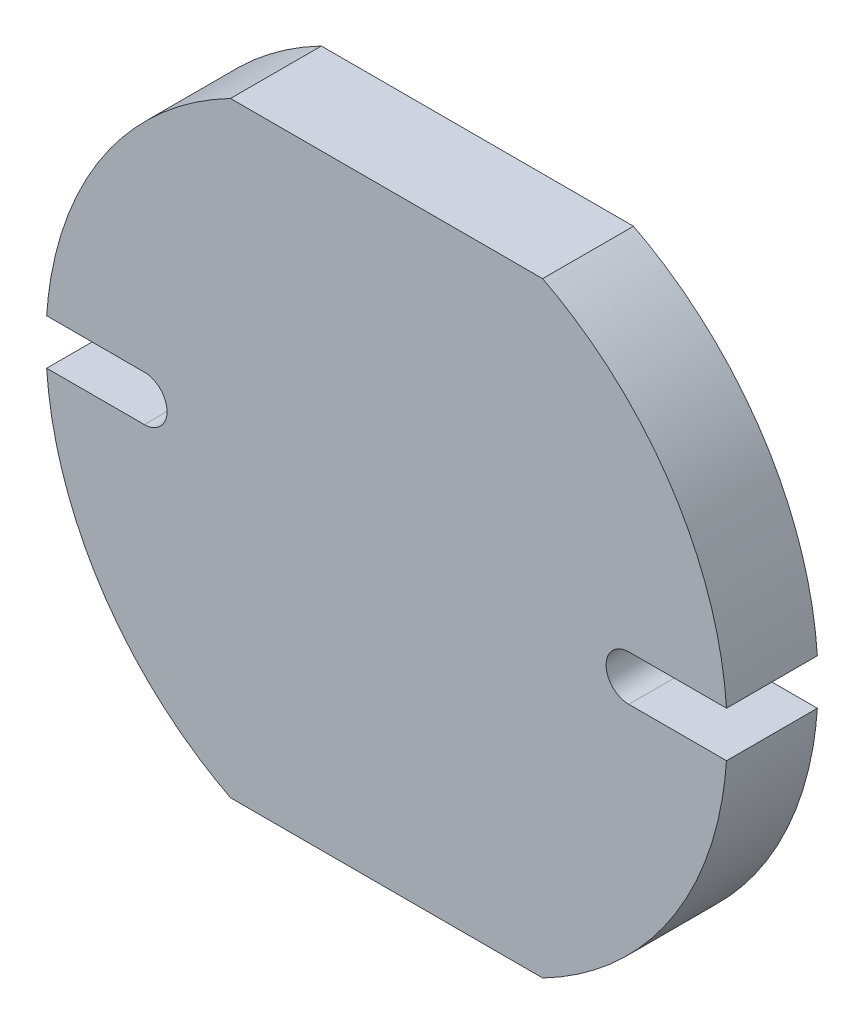
ISO-10303-21;
HEADER;
FILE_DESCRIPTION(('STEP AP214'),'2;1');
FILE_NAME('part.step','',(''),(''),'','','');
FILE_SCHEMA(('AUTOMOTIVE_DESIGN { 1 0 10303 214 1 1 1 1 }'));
ENDSEC;
DATA;
#1=APPLICATION_CONTEXT('core data for automotive mechanical design processes');
#2=APPLICATION_PROTOCOL_DEFINITION('international standard','automotive_design',2000,#1);
#3=PRODUCT_CONTEXT('',#1,'mechanical');
#4=PRODUCT('Part','Part','',(#3));
#5=PRODUCT_RELATED_PRODUCT_CATEGORY('part','',(#4));
#6=PRODUCT_DEFINITION_FORMATION('','',#4);
#7=PRODUCT_DEFINITION_CONTEXT('part definition',#1,'design');
#8=PRODUCT_DEFINITION('design','',#6,#7);
#9=PRODUCT_DEFINITION_SHAPE('','',#8);
#10=(LENGTH_UNIT() NAMED_UNIT(*) SI_UNIT(.MILLI.,.METRE.));
#11=(NAMED_UNIT(*) PLANE_ANGLE_UNIT() SI_UNIT($,.RADIAN.));
#12=(NAMED_UNIT(*) SI_UNIT($,.STERADIAN.) SOLID_ANGLE_UNIT());
#13=UNCERTAINTY_MEASURE_WITH_UNIT(LENGTH_MEASURE(1.E-05),#10,'distance_accuracy_value','');
#14=(GEOMETRIC_REPRESENTATION_CONTEXT(3) GLOBAL_UNCERTAINTY_ASSIGNED_CONTEXT((#13)) GLOBAL_UNIT_ASSIGNED_CONTEXT((#10,
#11,#12)) REPRESENTATION_CONTEXT('',''));
#15=CARTESIAN_POINT('',(0.,0.,0.));
#16=DIRECTION('',(0.,0.,1.));
#17=DIRECTION('',(1.,0.,0.));
#18=AXIS2_PLACEMENT_3D('',#15,#16,#17);
#19=CARTESIAN_POINT('',(-2.244994432064,-2.,0.6));
#20=CARTESIAN_POINT('',(-2.244994432064,2.,0.6));
#21=CARTESIAN_POINT('',(2.244994432064,-2.,0.6));
#22=CARTESIAN_POINT('',(2.244994432064,2.,0.6));
#23=(BOUNDED_SURFACE() B_SPLINE_SURFACE(1,1,((#19,#20),(#21,#22)),.UNSPECIFIED.,.F.,.F.,
.F.) B_SPLINE_SURFACE_WITH_KNOTS((2,2),(2,2),(-2.244994432064,2.244994432064),(-2.,2.),
.UNSPECIFIED.) GEOMETRIC_REPRESENTATION_ITEM() RATIONAL_B_SPLINE_SURFACE(((1.,1.),(1.,1.))) REPRESENTATION_ITEM('') SURFACE());
#24=CARTESIAN_POINT('',(-2.244994432064,-0.149999999998,0.6));
#25=CARTESIAN_POINT('',(-2.160281546554,-1.417866375311,0.6));
#26=CARTESIAN_POINT('',(-1.030776406404,-2.,0.6));
#27=(BOUNDED_CURVE() B_SPLINE_CURVE(2,(#24,#25,#26),.UNSPECIFIED.,.F.,
.F.) B_SPLINE_CURVE_WITH_KNOTS((3,3),(1.637512475204,2.66571040393),
.UNSPECIFIED.) CURVE() GEOMETRIC_REPRESENTATION_ITEM() RATIONAL_B_SPLINE_CURVE((1.,
0.870736160409,1.)) REPRESENTATION_ITEM(''));
#28=CARTESIAN_POINT('',(-2.244994432064,-0.149999999998,0.6));
#29=VERTEX_POINT('',#28);
#30=CARTESIAN_POINT('',(-1.030776406404,-2.,0.6));
#31=VERTEX_POINT('',#30);
#32=EDGE_CURVE('E145',#29,#31,#27,.T.);
#33=CARTESIAN_POINT('',(-1.030776406404,-2.,0.6));
#34=CARTESIAN_POINT('',(1.030776406404,-2.,0.6));
#35=(BOUNDED_CURVE() B_SPLINE_CURVE(1,(#33,#34),.UNSPECIFIED.,.F.,
.F.) B_SPLINE_CURVE_WITH_KNOTS((2,2),(0.,2.061552812808),
.UNSPECIFIED.) CURVE() GEOMETRIC_REPRESENTATION_ITEM() RATIONAL_B_SPLINE_CURVE((1.,1.)) REPRESENTATION_ITEM(''));
#36=CARTESIAN_POINT('',(1.030776406404,-2.,0.6));
#37=VERTEX_POINT('',#36);
#38=EDGE_CURVE('E372',#31,#37,#35,.T.);
#39=CARTESIAN_POINT('',(1.030776406404,-2.,0.6));
#40=CARTESIAN_POINT('',(2.160281546554,-1.417866375311,0.6));
#41=CARTESIAN_POINT('',(2.244994432064,-0.149999999998,0.6));
#42=(BOUNDED_CURVE() B_SPLINE_CURVE(2,(#39,#40,#41),.UNSPECIFIED.,.F.,
.F.) B_SPLINE_CURVE_WITH_KNOTS((3,3),(3.61747490325,4.645672831975),
.UNSPECIFIED.) CURVE() GEOMETRIC_REPRESENTATION_ITEM() RATIONAL_B_SPLINE_CURVE((1.,
0.870736160409,1.)) REPRESENTATION_ITEM(''));
#43=CARTESIAN_POINT('',(2.244994432064,-0.149999999998,0.6));
#44=VERTEX_POINT('',#43);
#45=EDGE_CURVE('E189',#37,#44,#42,.T.);
#46=CARTESIAN_POINT('',(2.244994432064,-0.149999999998,0.6));
#47=CARTESIAN_POINT('',(1.6,-0.149999999998,0.6));
#48=(BOUNDED_CURVE() B_SPLINE_CURVE(1,(#46,#47),.UNSPECIFIED.,.F.,
.F.) B_SPLINE_CURVE_WITH_KNOTS((2,2),(0.,0.644994432064),
.UNSPECIFIED.) CURVE() GEOMETRIC_REPRESENTATION_ITEM() RATIONAL_B_SPLINE_CURVE((1.,1.)) REPRESENTATION_ITEM(''));
#49=CARTESIAN_POINT('',(1.6,-0.149999999999,0.6));
#50=VERTEX_POINT('',#49);
#51=EDGE_CURVE('E317',#44,#50,#48,.T.);
#52=CARTESIAN_POINT('',(1.6,0.15,0.6));
#53=CARTESIAN_POINT('',(1.45,0.15,0.6));
#54=CARTESIAN_POINT('',(1.45,0.,0.6));
#55=CARTESIAN_POINT('',(1.45,-0.15,0.6));
#56=CARTESIAN_POINT('',(1.6,-0.15,0.6));
#57=(BOUNDED_CURVE() B_SPLINE_CURVE(2,(#52,#53,#54,#55,#56),.UNSPECIFIED.,.F.,
.F.) B_SPLINE_CURVE_WITH_KNOTS((3,2,3),(0.,1.570796326795,3.14159265359),
.UNSPECIFIED.) CURVE() GEOMETRIC_REPRESENTATION_ITEM() RATIONAL_B_SPLINE_CURVE((1.,
0.707106781187,1.,0.707106781187,1.)) REPRESENTATION_ITEM(''));
#58=CARTESIAN_POINT('',(1.6,0.149999999999,0.6));
#59=VERTEX_POINT('',#58);
#60=EDGE_CURVE('E23',#59,#50,#57,.T.);
#61=CARTESIAN_POINT('',(2.244994432064,0.149999999998,0.6));
#62=CARTESIAN_POINT('',(1.6,0.149999999998,0.6));
#63=(BOUNDED_CURVE() B_SPLINE_CURVE(1,(#61,#62),.UNSPECIFIED.,.F.,
.F.) B_SPLINE_CURVE_WITH_KNOTS((2,2),(0.,0.644994432064),
.UNSPECIFIED.) CURVE() GEOMETRIC_REPRESENTATION_ITEM() RATIONAL_B_SPLINE_CURVE((1.,1.)) REPRESENTATION_ITEM(''));
#64=CARTESIAN_POINT('',(2.244994432064,0.149999999998,0.6));
#65=VERTEX_POINT('',#64);
#66=EDGE_CURVE('E363',#65,#59,#63,.T.);
#67=CARTESIAN_POINT('',(2.244994432064,0.149999999998,0.6));
#68=CARTESIAN_POINT('',(2.160281546554,1.417866375311,0.6));
#69=CARTESIAN_POINT('',(1.030776406404,2.,0.6));
#70=(BOUNDED_CURVE() B_SPLINE_CURVE(2,(#67,#68,#69),.UNSPECIFIED.,.F.,
.F.) B_SPLINE_CURVE_WITH_KNOTS((3,3),(4.779105128794,5.807303057519),
.UNSPECIFIED.) CURVE() GEOMETRIC_REPRESENTATION_ITEM() RATIONAL_B_SPLINE_CURVE((1.,
0.870736160409,1.)) REPRESENTATION_ITEM(''));
#71=CARTESIAN_POINT('',(1.030776406404,2.,0.6));
#72=VERTEX_POINT('',#71);
#73=EDGE_CURVE('E219',#65,#72,#70,.T.);
#74=CARTESIAN_POINT('',(-1.030776406404,2.,0.6));
#75=CARTESIAN_POINT('',(1.030776406404,2.,0.6));
#76=(BOUNDED_CURVE() B_SPLINE_CURVE(1,(#74,#75),.UNSPECIFIED.,.F.,
.F.) B_SPLINE_CURVE_WITH_KNOTS((2,2),(0.,2.061552812808),
.UNSPECIFIED.) CURVE() GEOMETRIC_REPRESENTATION_ITEM() RATIONAL_B_SPLINE_CURVE((1.,1.)) REPRESENTATION_ITEM(''));
#77=CARTESIAN_POINT('',(-1.030776406404,2.,0.6));
#78=VERTEX_POINT('',#77);
#79=EDGE_CURVE('E257',#78,#72,#76,.T.);
#80=CARTESIAN_POINT('',(-1.030776406404,2.,0.6));
#81=CARTESIAN_POINT('',(-2.160281546554,1.417866375311,0.6));
#82=CARTESIAN_POINT('',(-2.244994432064,0.149999999999,0.6));
#83=(BOUNDED_CURVE() B_SPLINE_CURVE(2,(#80,#81,#82),.UNSPECIFIED.,.F.,
.F.) B_SPLINE_CURVE_WITH_KNOTS((3,3),(0.47588224966,1.504080178385),
.UNSPECIFIED.) CURVE() GEOMETRIC_REPRESENTATION_ITEM() RATIONAL_B_SPLINE_CURVE((1.,
0.87073616041,1.)) REPRESENTATION_ITEM(''));
#84=CARTESIAN_POINT('',(-2.244994432064,0.149999999999,0.6));
#85=VERTEX_POINT('',#84);
#86=EDGE_CURVE('E209',#78,#85,#83,.T.);
#87=CARTESIAN_POINT('',(-2.244994432064,0.15,0.6));
#88=CARTESIAN_POINT('',(-1.6,0.15,0.6));
#89=(BOUNDED_CURVE() B_SPLINE_CURVE(1,(#87,#88),.UNSPECIFIED.,.F.,
.F.) B_SPLINE_CURVE_WITH_KNOTS((2,2),(0.,0.644994432064),
.UNSPECIFIED.) CURVE() GEOMETRIC_REPRESENTATION_ITEM() RATIONAL_B_SPLINE_CURVE((1.,1.)) REPRESENTATION_ITEM(''));
#90=CARTESIAN_POINT('',(-1.6,0.15,0.6));
#91=VERTEX_POINT('',#90);
#92=EDGE_CURVE('E63',#85,#91,#89,.T.);
#93=CARTESIAN_POINT('',(-1.6,-0.15,0.6));
#94=CARTESIAN_POINT('',(-1.45,-0.15,0.6));
#95=CARTESIAN_POINT('',(-1.45,0.,0.6));
#96=CARTESIAN_POINT('',(-1.45,0.15,0.6));
#97=CARTESIAN_POINT('',(-1.6,0.15,0.6));
#98=(BOUNDED_CURVE() B_SPLINE_CURVE(2,(#93,#94,#95,#96,#97),.UNSPECIFIED.,.F.,
.F.) B_SPLINE_CURVE_WITH_KNOTS((3,2,3),(3.14159265359,4.712388980385,6.28318530718),
.UNSPECIFIED.) CURVE() GEOMETRIC_REPRESENTATION_ITEM() RATIONAL_B_SPLINE_CURVE((1.,
0.707106781187,1.,0.707106781187,1.)) REPRESENTATION_ITEM(''));
#99=CARTESIAN_POINT('',(-1.6,-0.149999999999,0.6));
#100=VERTEX_POINT('',#99);
#101=EDGE_CURVE('E147',#100,#91,#98,.T.);
#102=CARTESIAN_POINT('',(-2.244994432064,-0.149999999998,0.6));
#103=CARTESIAN_POINT('',(-1.6,-0.149999999998,0.6));
#104=(BOUNDED_CURVE() B_SPLINE_CURVE(1,(#102,#103),.UNSPECIFIED.,.F.,
.F.) B_SPLINE_CURVE_WITH_KNOTS((2,2),(0.,0.644994432064),
.UNSPECIFIED.) CURVE() GEOMETRIC_REPRESENTATION_ITEM() RATIONAL_B_SPLINE_CURVE((1.,1.)) REPRESENTATION_ITEM(''));
#105=EDGE_CURVE('E32',#29,#100,#104,.T.);
#106=ORIENTED_EDGE('',*,*,#32,.T.);
#107=ORIENTED_EDGE('',*,*,#38,.T.);
#108=ORIENTED_EDGE('',*,*,#45,.T.);
#109=ORIENTED_EDGE('',*,*,#51,.T.);
#110=ORIENTED_EDGE('',*,*,#60,.F.);
#111=ORIENTED_EDGE('',*,*,#66,.F.);
#112=ORIENTED_EDGE('',*,*,#73,.T.);
#113=ORIENTED_EDGE('',*,*,#79,.F.);
#114=ORIENTED_EDGE('',*,*,#86,.T.);
#115=ORIENTED_EDGE('',*,*,#92,.T.);
#116=ORIENTED_EDGE('',*,*,#101,.F.);
#117=ORIENTED_EDGE('',*,*,#105,.F.);
#118=EDGE_LOOP('',(#106,#107,#108,#109,#110,#111,#112,#113,#114,#115,#116,#117));
#119=FACE_BOUND('',#118,.T.);
#120=ADVANCED_FACE('F17',(#119),#23,.T.);
#121=CARTESIAN_POINT('',(-2.244994432064,-2.,0.));
#122=CARTESIAN_POINT('',(-2.244994432064,2.,0.));
#123=CARTESIAN_POINT('',(2.244994432064,-2.,0.));
#124=CARTESIAN_POINT('',(2.244994432064,2.,0.));
#125=(BOUNDED_SURFACE() B_SPLINE_SURFACE(1,1,((#121,#122),(#123,#124)),.UNSPECIFIED.,.F.,.F.,
.F.) B_SPLINE_SURFACE_WITH_KNOTS((2,2),(2,2),(-2.244994432064,2.244994432064),(-2.,2.),
.UNSPECIFIED.) GEOMETRIC_REPRESENTATION_ITEM() RATIONAL_B_SPLINE_SURFACE(((1.,1.),(1.,1.))) REPRESENTATION_ITEM('') SURFACE());
#126=CARTESIAN_POINT('',(-2.244994432064,-0.149999999998,0.));
#127=CARTESIAN_POINT('',(-1.6,-0.149999999998,0.));
#128=(BOUNDED_CURVE() B_SPLINE_CURVE(1,(#126,#127),.UNSPECIFIED.,.F.,
.F.) B_SPLINE_CURVE_WITH_KNOTS((2,2),(0.,0.644994432064),
.UNSPECIFIED.) CURVE() GEOMETRIC_REPRESENTATION_ITEM() RATIONAL_B_SPLINE_CURVE((1.,1.)) REPRESENTATION_ITEM(''));
#129=CARTESIAN_POINT('',(-2.244994432064,-0.149999999998,0.));
#130=VERTEX_POINT('',#129);
#131=CARTESIAN_POINT('',(-1.6,-0.149999999999,0.));
#132=VERTEX_POINT('',#131);
#133=EDGE_CURVE('E11',#130,#132,#128,.T.);
#134=CARTESIAN_POINT('',(-1.6,-0.15,0.));
#135=CARTESIAN_POINT('',(-1.45,-0.15,0.));
#136=CARTESIAN_POINT('',(-1.45,0.,0.));
#137=CARTESIAN_POINT('',(-1.45,0.15,0.));
#138=CARTESIAN_POINT('',(-1.6,0.15,0.));
#139=(BOUNDED_CURVE() B_SPLINE_CURVE(2,(#134,#135,#136,#137,#138),.UNSPECIFIED.,.F.,
.F.) B_SPLINE_CURVE_WITH_KNOTS((3,2,3),(3.14159265359,4.712388980385,6.28318530718),
.UNSPECIFIED.) CURVE() GEOMETRIC_REPRESENTATION_ITEM() RATIONAL_B_SPLINE_CURVE((1.,
0.707106781187,1.,0.707106781187,1.)) REPRESENTATION_ITEM(''));
#140=CARTESIAN_POINT('',(-1.6,0.15,0.));
#141=VERTEX_POINT('',#140);
#142=EDGE_CURVE('E150',#132,#141,#139,.T.);
#143=CARTESIAN_POINT('',(-2.244994432064,0.15,0.));
#144=CARTESIAN_POINT('',(-1.6,0.15,0.));
#145=(BOUNDED_CURVE() B_SPLINE_CURVE(1,(#143,#144),.UNSPECIFIED.,.F.,
.F.) B_SPLINE_CURVE_WITH_KNOTS((2,2),(0.,0.644994432064),
.UNSPECIFIED.) CURVE() GEOMETRIC_REPRESENTATION_ITEM() RATIONAL_B_SPLINE_CURVE((1.,1.)) REPRESENTATION_ITEM(''));
#146=CARTESIAN_POINT('',(-2.244994432064,0.149999999999,0.));
#147=VERTEX_POINT('',#146);
#148=EDGE_CURVE('E78',#147,#141,#145,.T.);
#149=CARTESIAN_POINT('',(-1.030776406404,2.,0.));
#150=CARTESIAN_POINT('',(-2.160281546554,1.417866375311,0.));
#151=CARTESIAN_POINT('',(-2.244994432064,0.149999999999,0.));
#152=(BOUNDED_CURVE() B_SPLINE_CURVE(2,(#149,#150,#151),.UNSPECIFIED.,.F.,
.F.) B_SPLINE_CURVE_WITH_KNOTS((3,3),(0.47588224966,1.504080178385),
.UNSPECIFIED.) CURVE() GEOMETRIC_REPRESENTATION_ITEM() RATIONAL_B_SPLINE_CURVE((1.,
0.87073616041,1.)) REPRESENTATION_ITEM(''));
#153=CARTESIAN_POINT('',(-1.030776406404,2.,0.));
#154=VERTEX_POINT('',#153);
#155=EDGE_CURVE('E210',#154,#147,#152,.T.);
#156=CARTESIAN_POINT('',(-1.030776406404,2.,0.));
#157=CARTESIAN_POINT('',(1.030776406404,2.,0.));
#158=(BOUNDED_CURVE() B_SPLINE_CURVE(1,(#156,#157),.UNSPECIFIED.,.F.,
.F.) B_SPLINE_CURVE_WITH_KNOTS((2,2),(0.,2.061552812808),
.UNSPECIFIED.) CURVE() GEOMETRIC_REPRESENTATION_ITEM() RATIONAL_B_SPLINE_CURVE((1.,1.)) REPRESENTATION_ITEM(''));
#159=CARTESIAN_POINT('',(1.030776406404,2.,0.));
#160=VERTEX_POINT('',#159);
#161=EDGE_CURVE('E265',#154,#160,#158,.T.);
#162=CARTESIAN_POINT('',(2.244994432064,0.149999999998,0.));
#163=CARTESIAN_POINT('',(2.160281546554,1.417866375311,0.));
#164=CARTESIAN_POINT('',(1.030776406404,2.,0.));
#165=(BOUNDED_CURVE() B_SPLINE_CURVE(2,(#162,#163,#164),.UNSPECIFIED.,.F.,
.F.) B_SPLINE_CURVE_WITH_KNOTS((3,3),(4.779105128794,5.807303057519),
.UNSPECIFIED.) CURVE() GEOMETRIC_REPRESENTATION_ITEM() RATIONAL_B_SPLINE_CURVE((1.,
0.870736160409,1.)) REPRESENTATION_ITEM(''));
#166=CARTESIAN_POINT('',(2.244994432064,0.149999999998,0.));
#167=VERTEX_POINT('',#166);
#168=EDGE_CURVE('E331',#167,#160,#165,.T.);
#169=CARTESIAN_POINT('',(2.244994432064,0.149999999998,0.));
#170=CARTESIAN_POINT('',(1.6,0.149999999998,0.));
#171=(BOUNDED_CURVE() B_SPLINE_CURVE(1,(#169,#170),.UNSPECIFIED.,.F.,
.F.) B_SPLINE_CURVE_WITH_KNOTS((2,2),(0.,0.644994432064),
.UNSPECIFIED.) CURVE() GEOMETRIC_REPRESENTATION_ITEM() RATIONAL_B_SPLINE_CURVE((1.,1.)) REPRESENTATION_ITEM(''));
#172=CARTESIAN_POINT('',(1.6,0.149999999999,0.));
#173=VERTEX_POINT('',#172);
#174=EDGE_CURVE('E340',#167,#173,#171,.T.);
#175=CARTESIAN_POINT('',(1.6,0.15,0.));
#176=CARTESIAN_POINT('',(1.45,0.15,0.));
#177=CARTESIAN_POINT('',(1.45,0.,0.));
#178=CARTESIAN_POINT('',(1.45,-0.15,0.));
#179=CARTESIAN_POINT('',(1.6,-0.15,0.));
#180=(BOUNDED_CURVE() B_SPLINE_CURVE(2,(#175,#176,#177,#178,#179),.UNSPECIFIED.,.F.,
.F.) B_SPLINE_CURVE_WITH_KNOTS((3,2,3),(0.,1.570796326795,3.14159265359),
.UNSPECIFIED.) CURVE() GEOMETRIC_REPRESENTATION_ITEM() RATIONAL_B_SPLINE_CURVE((1.,
0.707106781187,1.,0.707106781187,1.)) REPRESENTATION_ITEM(''));
#181=CARTESIAN_POINT('',(1.6,-0.149999999999,0.));
#182=VERTEX_POINT('',#181);
#183=EDGE_CURVE('E112',#173,#182,#180,.T.);
#184=CARTESIAN_POINT('',(2.244994432064,-0.149999999998,0.));
#185=CARTESIAN_POINT('',(1.6,-0.149999999998,0.));
#186=(BOUNDED_CURVE() B_SPLINE_CURVE(1,(#184,#185),.UNSPECIFIED.,.F.,
.F.) B_SPLINE_CURVE_WITH_KNOTS((2,2),(0.,0.644994432064),
.UNSPECIFIED.) CURVE() GEOMETRIC_REPRESENTATION_ITEM() RATIONAL_B_SPLINE_CURVE((1.,1.)) REPRESENTATION_ITEM(''));
#187=CARTESIAN_POINT('',(2.244994432064,-0.149999999998,0.));
#188=VERTEX_POINT('',#187);
#189=EDGE_CURVE('E190',#188,#182,#186,.T.);
#190=CARTESIAN_POINT('',(1.030776406404,-2.,0.));
#191=CARTESIAN_POINT('',(2.160281546554,-1.417866375311,0.));
#192=CARTESIAN_POINT('',(2.244994432064,-0.149999999998,0.));
#193=(BOUNDED_CURVE() B_SPLINE_CURVE(2,(#190,#191,#192),.UNSPECIFIED.,.F.,
.F.) B_SPLINE_CURVE_WITH_KNOTS((3,3),(3.61747490325,4.645672831975),
.UNSPECIFIED.) CURVE() GEOMETRIC_REPRESENTATION_ITEM() RATIONAL_B_SPLINE_CURVE((1.,
0.870736160409,1.)) REPRESENTATION_ITEM(''));
#194=CARTESIAN_POINT('',(1.030776406404,-2.,0.));
#195=VERTEX_POINT('',#194);
#196=EDGE_CURVE('E177',#195,#188,#193,.T.);
#197=CARTESIAN_POINT('',(-1.030776406404,-2.,0.));
#198=CARTESIAN_POINT('',(1.030776406404,-2.,0.));
#199=(BOUNDED_CURVE() B_SPLINE_CURVE(1,(#197,#198),.UNSPECIFIED.,.F.,
.F.) B_SPLINE_CURVE_WITH_KNOTS((2,2),(0.,2.061552812808),
.UNSPECIFIED.) CURVE() GEOMETRIC_REPRESENTATION_ITEM() RATIONAL_B_SPLINE_CURVE((1.,1.)) REPRESENTATION_ITEM(''));
#200=CARTESIAN_POINT('',(-1.030776406404,-2.,0.));
#201=VERTEX_POINT('',#200);
#202=EDGE_CURVE('E160',#201,#195,#199,.T.);
#203=CARTESIAN_POINT('',(-2.244994432064,-0.149999999998,0.));
#204=CARTESIAN_POINT('',(-2.160281546554,-1.417866375311,0.));
#205=CARTESIAN_POINT('',(-1.030776406404,-2.,0.));
#206=(BOUNDED_CURVE() B_SPLINE_CURVE(2,(#203,#204,#205),.UNSPECIFIED.,.F.,
.F.) B_SPLINE_CURVE_WITH_KNOTS((3,3),(1.637512475204,2.66571040393),
.UNSPECIFIED.) CURVE() GEOMETRIC_REPRESENTATION_ITEM() RATIONAL_B_SPLINE_CURVE((1.,
0.870736160409,1.)) REPRESENTATION_ITEM(''));
#207=EDGE_CURVE('E171',#130,#201,#206,.T.);
#208=ORIENTED_EDGE('',*,*,#133,.T.);
#209=ORIENTED_EDGE('',*,*,#142,.T.);
#210=ORIENTED_EDGE('',*,*,#148,.F.);
#211=ORIENTED_EDGE('',*,*,#155,.F.);
#212=ORIENTED_EDGE('',*,*,#161,.T.);
#213=ORIENTED_EDGE('',*,*,#168,.F.);
#214=ORIENTED_EDGE('',*,*,#174,.T.);
#215=ORIENTED_EDGE('',*,*,#183,.T.);
#216=ORIENTED_EDGE('',*,*,#189,.F.);
#217=ORIENTED_EDGE('',*,*,#196,.F.);
#218=ORIENTED_EDGE('',*,*,#202,.F.);
#219=ORIENTED_EDGE('',*,*,#207,.F.);
#220=EDGE_LOOP('',(#208,#209,#210,#211,#212,#213,#214,#215,#216,#217,#218,#219));
#221=FACE_BOUND('',#220,.T.);
#222=ADVANCED_FACE('F19',(#221),#125,.F.);
#223=CARTESIAN_POINT('',(-2.244994432064,-0.149999999998,0.6));
#224=CARTESIAN_POINT('',(-2.244994432064,-0.149999999998,0.));
#225=CARTESIAN_POINT('',(-1.6,-0.149999999998,0.6));
#226=CARTESIAN_POINT('',(-1.6,-0.149999999998,0.));
#227=(BOUNDED_SURFACE() B_SPLINE_SURFACE(1,1,((#223,#224),(#225,#226)),.UNSPECIFIED.,.F.,.F.,
.F.) B_SPLINE_SURFACE_WITH_KNOTS((2,2),(2,2),(0.,0.644994432064),(-0.6,0.),
.UNSPECIFIED.) GEOMETRIC_REPRESENTATION_ITEM() RATIONAL_B_SPLINE_SURFACE(((1.,1.),(1.,1.))) REPRESENTATION_ITEM('') SURFACE());
#228=CARTESIAN_POINT('',(-2.244994432064,-0.149999999998,0.));
#229=CARTESIAN_POINT('',(-2.244994432064,-0.149999999998,0.6));
#230=(BOUNDED_CURVE() B_SPLINE_CURVE(1,(#228,#229),.UNSPECIFIED.,.F.,
.F.) B_SPLINE_CURVE_WITH_KNOTS((2,2),(0.,0.6),
.UNSPECIFIED.) CURVE() GEOMETRIC_REPRESENTATION_ITEM() RATIONAL_B_SPLINE_CURVE((1.,1.)) REPRESENTATION_ITEM(''));
#231=EDGE_CURVE('E154',#130,#29,#230,.T.);
#232=CARTESIAN_POINT('',(-1.6,-0.149999999999,0.));
#233=CARTESIAN_POINT('',(-1.6,-0.149999999999,0.6));
#234=(BOUNDED_CURVE() B_SPLINE_CURVE(1,(#232,#233),.UNSPECIFIED.,.F.,
.F.) B_SPLINE_CURVE_WITH_KNOTS((2,2),(0.,0.6),
.UNSPECIFIED.) CURVE() GEOMETRIC_REPRESENTATION_ITEM() RATIONAL_B_SPLINE_CURVE((1.,1.)) REPRESENTATION_ITEM(''));
#235=EDGE_CURVE('E244',#132,#100,#234,.T.);
#236=ORIENTED_EDGE('',*,*,#231,.T.);
#237=ORIENTED_EDGE('',*,*,#105,.T.);
#238=ORIENTED_EDGE('',*,*,#235,.F.);
#239=ORIENTED_EDGE('',*,*,#133,.F.);
#240=EDGE_LOOP('',(#236,#237,#238,#239));
#241=FACE_BOUND('',#240,.T.);
#242=ADVANCED_FACE('F155',(#241),#227,.T.);
#243=CARTESIAN_POINT('',(-1.6,0.15,0.6));
#244=CARTESIAN_POINT('',(-1.6,0.15,0.));
#245=CARTESIAN_POINT('',(-1.45,0.15,0.6));
#246=CARTESIAN_POINT('',(-1.45,0.15,0.));
#247=CARTESIAN_POINT('',(-1.45,0.,0.6));
#248=CARTESIAN_POINT('',(-1.45,0.,0.));
#249=CARTESIAN_POINT('',(-1.45,-0.15,0.6));
#250=CARTESIAN_POINT('',(-1.45,-0.15,0.));
#251=CARTESIAN_POINT('',(-1.6,-0.15,0.6));
#252=CARTESIAN_POINT('',(-1.6,-0.15,0.));
#253=(BOUNDED_SURFACE() B_SPLINE_SURFACE(2,1,((#243,#244),(#245,#246),(#247,#248),(#249,#250),
(#251,#252)),.UNSPECIFIED.,.F.,.F.,.F.) B_SPLINE_SURFACE_WITH_KNOTS((3,2,3),(2,2),(0.,
1.570796326795,3.14159265359),(-0.6,0.),
.UNSPECIFIED.) GEOMETRIC_REPRESENTATION_ITEM() RATIONAL_B_SPLINE_SURFACE(((1.,1.),
(0.707106781187,0.707106781187),(1.,1.),(0.707106781187,0.707106781187),(1.,1.))) REPRESENTATION_ITEM('') SURFACE());
#254=CARTESIAN_POINT('',(-1.6,0.15,0.));
#255=CARTESIAN_POINT('',(-1.6,0.15,0.6));
#256=(BOUNDED_CURVE() B_SPLINE_CURVE(1,(#254,#255),.UNSPECIFIED.,.F.,
.F.) B_SPLINE_CURVE_WITH_KNOTS((2,2),(0.,0.6),
.UNSPECIFIED.) CURVE() GEOMETRIC_REPRESENTATION_ITEM() RATIONAL_B_SPLINE_CURVE((1.,1.)) REPRESENTATION_ITEM(''));
#257=EDGE_CURVE('E218',#141,#91,#256,.T.);
#258=ORIENTED_EDGE('',*,*,#235,.T.);
#259=ORIENTED_EDGE('',*,*,#101,.T.);
#260=ORIENTED_EDGE('',*,*,#257,.F.);
#261=ORIENTED_EDGE('',*,*,#142,.F.);
#262=EDGE_LOOP('',(#258,#259,#260,#261));
#263=FACE_BOUND('',#262,.T.);
#264=ADVANCED_FACE('F422',(#263),#253,.F.);
#265=CARTESIAN_POINT('',(-2.244994432064,0.15,0.6));
#266=CARTESIAN_POINT('',(-2.244994432064,0.15,0.));
#267=CARTESIAN_POINT('',(-1.6,0.15,0.6));
#268=CARTESIAN_POINT('',(-1.6,0.15,0.));
#269=(BOUNDED_SURFACE() B_SPLINE_SURFACE(1,1,((#265,#266),(#267,#268)),.UNSPECIFIED.,.F.,.F.,
.F.) B_SPLINE_SURFACE_WITH_KNOTS((2,2),(2,2),(0.,0.644994432064),(-0.6,0.),
.UNSPECIFIED.) GEOMETRIC_REPRESENTATION_ITEM() RATIONAL_B_SPLINE_SURFACE(((1.,1.),(1.,1.))) REPRESENTATION_ITEM('') SURFACE());
#270=CARTESIAN_POINT('',(-2.244994432064,0.149999999999,0.));
#271=CARTESIAN_POINT('',(-2.244994432064,0.149999999999,0.6));
#272=(BOUNDED_CURVE() B_SPLINE_CURVE(1,(#270,#271),.UNSPECIFIED.,.F.,
.F.) B_SPLINE_CURVE_WITH_KNOTS((2,2),(0.,0.6),
.UNSPECIFIED.) CURVE() GEOMETRIC_REPRESENTATION_ITEM() RATIONAL_B_SPLINE_CURVE((1.,1.)) REPRESENTATION_ITEM(''));
#273=EDGE_CURVE('E200',#147,#85,#272,.T.);
#274=ORIENTED_EDGE('',*,*,#148,.T.);
#275=ORIENTED_EDGE('',*,*,#257,.T.);
#276=ORIENTED_EDGE('',*,*,#92,.F.);
#277=ORIENTED_EDGE('',*,*,#273,.F.);
#278=EDGE_LOOP('',(#274,#275,#276,#277));
#279=FACE_BOUND('',#278,.T.);
#280=ADVANCED_FACE('F513',(#279),#269,.F.);
#281=CARTESIAN_POINT('',(-2.244994432064,0.149999999999,0.6));
#282=CARTESIAN_POINT('',(-2.244994432064,0.149999999999,0.));
#283=CARTESIAN_POINT('',(-2.160281546554,1.417866375311,0.6));
#284=CARTESIAN_POINT('',(-2.160281546554,1.417866375311,0.));
#285=CARTESIAN_POINT('',(-1.030776406404,2.,0.6));
#286=CARTESIAN_POINT('',(-1.030776406404,2.,0.));
#287=(BOUNDED_SURFACE() B_SPLINE_SURFACE(2,1,((#281,#282),(#283,#284),(#285,#286)),
.UNSPECIFIED.,.F.,.F.,.F.) B_SPLINE_SURFACE_WITH_KNOTS((3,3),(2,2),(4.779105128794,
5.80730305752),(-0.6,0.),
.UNSPECIFIED.) GEOMETRIC_REPRESENTATION_ITEM() RATIONAL_B_SPLINE_SURFACE(((1.,1.),
(0.87073616041,0.87073616041),(1.,1.))) REPRESENTATION_ITEM('') SURFACE());
#288=CARTESIAN_POINT('',(-1.030776406404,2.,0.));
#289=CARTESIAN_POINT('',(-1.030776406404,2.,0.6));
#290=(BOUNDED_CURVE() B_SPLINE_CURVE(1,(#288,#289),.UNSPECIFIED.,.F.,
.F.) B_SPLINE_CURVE_WITH_KNOTS((2,2),(0.,0.6),
.UNSPECIFIED.) CURVE() GEOMETRIC_REPRESENTATION_ITEM() RATIONAL_B_SPLINE_CURVE((1.,1.)) REPRESENTATION_ITEM(''));
#291=EDGE_CURVE('E228',#154,#78,#290,.T.);
#292=ORIENTED_EDGE('',*,*,#155,.T.);
#293=ORIENTED_EDGE('',*,*,#273,.T.);
#294=ORIENTED_EDGE('',*,*,#86,.F.);
#295=ORIENTED_EDGE('',*,*,#291,.F.);
#296=EDGE_LOOP('',(#292,#293,#294,#295));
#297=FACE_BOUND('',#296,.T.);
#298=ADVANCED_FACE('F501',(#297),#287,.T.);
#299=CARTESIAN_POINT('',(-1.030776406404,2.,0.6));
#300=CARTESIAN_POINT('',(-1.030776406404,2.,0.));
#301=CARTESIAN_POINT('',(1.030776406404,2.,0.6));
#302=CARTESIAN_POINT('',(1.030776406404,2.,0.));
#303=(BOUNDED_SURFACE() B_SPLINE_SURFACE(1,1,((#299,#300),(#301,#302)),.UNSPECIFIED.,.F.,.F.,
.F.) B_SPLINE_SURFACE_WITH_KNOTS((2,2),(2,2),(0.,2.061552812808),(-0.6,0.),
.UNSPECIFIED.) GEOMETRIC_REPRESENTATION_ITEM() RATIONAL_B_SPLINE_SURFACE(((1.,1.),(1.,1.))) REPRESENTATION_ITEM('') SURFACE());
#304=CARTESIAN_POINT('',(1.030776406404,2.,0.));
#305=CARTESIAN_POINT('',(1.030776406404,2.,0.6));
#306=(BOUNDED_CURVE() B_SPLINE_CURVE(1,(#304,#305),.UNSPECIFIED.,.F.,
.F.) B_SPLINE_CURVE_WITH_KNOTS((2,2),(0.,0.6),
.UNSPECIFIED.) CURVE() GEOMETRIC_REPRESENTATION_ITEM() RATIONAL_B_SPLINE_CURVE((1.,1.)) REPRESENTATION_ITEM(''));
#307=EDGE_CURVE('E229',#160,#72,#306,.T.);
#308=ORIENTED_EDGE('',*,*,#291,.T.);
#309=ORIENTED_EDGE('',*,*,#79,.T.);
#310=ORIENTED_EDGE('',*,*,#307,.F.);
#311=ORIENTED_EDGE('',*,*,#161,.F.);
#312=EDGE_LOOP('',(#308,#309,#310,#311));
#313=FACE_BOUND('',#312,.T.);
#314=ADVANCED_FACE('F492',(#313),#303,.T.);
#315=CARTESIAN_POINT('',(1.030776406404,2.,0.6));
#316=CARTESIAN_POINT('',(1.030776406404,2.,0.));
#317=CARTESIAN_POINT('',(2.160281546554,1.417866375311,0.6));
#318=CARTESIAN_POINT('',(2.160281546554,1.417866375311,0.));
#319=CARTESIAN_POINT('',(2.244994432065,0.149999999998,0.6));
#320=CARTESIAN_POINT('',(2.244994432065,0.149999999998,0.));
#321=(BOUNDED_SURFACE() B_SPLINE_SURFACE(2,1,((#315,#316),(#317,#318),(#319,#320)),
.UNSPECIFIED.,.F.,.F.,.F.) B_SPLINE_SURFACE_WITH_KNOTS((3,3),(2,2),(0.47588224966,
1.504080178386),(-0.6,0.),
.UNSPECIFIED.) GEOMETRIC_REPRESENTATION_ITEM() RATIONAL_B_SPLINE_SURFACE(((1.,1.),
(0.870736160409,0.870736160409),(1.,1.))) REPRESENTATION_ITEM('') SURFACE());
#322=CARTESIAN_POINT('',(2.244994432064,0.149999999998,0.));
#323=CARTESIAN_POINT('',(2.244994432064,0.149999999998,0.6));
#324=(BOUNDED_CURVE() B_SPLINE_CURVE(1,(#322,#323),.UNSPECIFIED.,.F.,
.F.) B_SPLINE_CURVE_WITH_KNOTS((2,2),(0.,0.6),
.UNSPECIFIED.) CURVE() GEOMETRIC_REPRESENTATION_ITEM() RATIONAL_B_SPLINE_CURVE((1.,1.)) REPRESENTATION_ITEM(''));
#325=EDGE_CURVE('E324',#167,#65,#324,.T.);
#326=ORIENTED_EDGE('',*,*,#168,.T.);
#327=ORIENTED_EDGE('',*,*,#307,.T.);
#328=ORIENTED_EDGE('',*,*,#73,.F.);
#329=ORIENTED_EDGE('',*,*,#325,.F.);
#330=EDGE_LOOP('',(#326,#327,#328,#329));
#331=FACE_BOUND('',#330,.T.);
#332=ADVANCED_FACE('F469',(#331),#321,.T.);
#333=CARTESIAN_POINT('',(2.244994432064,0.149999999998,0.6));
#334=CARTESIAN_POINT('',(2.244994432064,0.149999999998,0.));
#335=CARTESIAN_POINT('',(1.6,0.149999999998,0.6));
#336=CARTESIAN_POINT('',(1.6,0.149999999998,0.));
#337=(BOUNDED_SURFACE() B_SPLINE_SURFACE(1,1,((#333,#334),(#335,#336)),.UNSPECIFIED.,.F.,.F.,
.F.) B_SPLINE_SURFACE_WITH_KNOTS((2,2),(2,2),(0.,0.644994432064),(-0.6,0.),
.UNSPECIFIED.) GEOMETRIC_REPRESENTATION_ITEM() RATIONAL_B_SPLINE_SURFACE(((1.,1.),(1.,1.))) REPRESENTATION_ITEM('') SURFACE());
#338=CARTESIAN_POINT('',(1.6,0.149999999999,0.));
#339=CARTESIAN_POINT('',(1.6,0.149999999999,0.6));
#340=(BOUNDED_CURVE() B_SPLINE_CURVE(1,(#338,#339),.UNSPECIFIED.,.F.,
.F.) B_SPLINE_CURVE_WITH_KNOTS((2,2),(0.,0.6),
.UNSPECIFIED.) CURVE() GEOMETRIC_REPRESENTATION_ITEM() RATIONAL_B_SPLINE_CURVE((1.,1.)) REPRESENTATION_ITEM(''));
#341=EDGE_CURVE('E348',#173,#59,#340,.T.);
#342=ORIENTED_EDGE('',*,*,#325,.T.);
#343=ORIENTED_EDGE('',*,*,#66,.T.);
#344=ORIENTED_EDGE('',*,*,#341,.F.);
#345=ORIENTED_EDGE('',*,*,#174,.F.);
#346=EDGE_LOOP('',(#342,#343,#344,#345));
#347=FACE_BOUND('',#346,.T.);
#348=ADVANCED_FACE('F481',(#347),#337,.T.);
#349=CARTESIAN_POINT('',(1.6,-0.15,0.6));
#350=CARTESIAN_POINT('',(1.6,-0.15,0.));
#351=CARTESIAN_POINT('',(1.45,-0.15,0.6));
#352=CARTESIAN_POINT('',(1.45,-0.15,0.));
#353=CARTESIAN_POINT('',(1.45,0.,0.6));
#354=CARTESIAN_POINT('',(1.45,0.,0.));
#355=CARTESIAN_POINT('',(1.45,0.15,0.6));
#356=CARTESIAN_POINT('',(1.45,0.15,0.));
#357=CARTESIAN_POINT('',(1.6,0.15,0.6));
#358=CARTESIAN_POINT('',(1.6,0.15,0.));
#359=(BOUNDED_SURFACE() B_SPLINE_SURFACE(2,1,((#349,#350),(#351,#352),(#353,#354),(#355,#356),
(#357,#358)),.UNSPECIFIED.,.F.,.F.,.F.) B_SPLINE_SURFACE_WITH_KNOTS((3,2,3),(2,2),
(3.14159265359,4.712388980385,6.28318530718),(-0.6,0.),
.UNSPECIFIED.) GEOMETRIC_REPRESENTATION_ITEM() RATIONAL_B_SPLINE_SURFACE(((1.,1.),
(0.707106781187,0.707106781187),(1.,1.),(0.707106781187,0.707106781187),(1.,1.))) REPRESENTATION_ITEM('') SURFACE());
#360=CARTESIAN_POINT('',(1.6,-0.149999999999,0.));
#361=CARTESIAN_POINT('',(1.6,-0.149999999999,0.6));
#362=(BOUNDED_CURVE() B_SPLINE_CURVE(1,(#360,#361),.UNSPECIFIED.,.F.,
.F.) B_SPLINE_CURVE_WITH_KNOTS((2,2),(0.,0.6),
.UNSPECIFIED.) CURVE() GEOMETRIC_REPRESENTATION_ITEM() RATIONAL_B_SPLINE_CURVE((1.,1.)) REPRESENTATION_ITEM(''));
#363=EDGE_CURVE('E199',#182,#50,#362,.T.);
#364=ORIENTED_EDGE('',*,*,#341,.T.);
#365=ORIENTED_EDGE('',*,*,#60,.T.);
#366=ORIENTED_EDGE('',*,*,#363,.F.);
#367=ORIENTED_EDGE('',*,*,#183,.F.);
#368=EDGE_LOOP('',(#364,#365,#366,#367));
#369=FACE_BOUND('',#368,.T.);
#370=ADVANCED_FACE('F490',(#369),#359,.F.);
#371=CARTESIAN_POINT('',(2.244994432064,-0.149999999998,0.6));
#372=CARTESIAN_POINT('',(2.244994432064,-0.149999999998,0.));
#373=CARTESIAN_POINT('',(1.6,-0.149999999998,0.6));
#374=CARTESIAN_POINT('',(1.6,-0.149999999998,0.));
#375=(BOUNDED_SURFACE() B_SPLINE_SURFACE(1,1,((#371,#372),(#373,#374)),.UNSPECIFIED.,.F.,.F.,
.F.) B_SPLINE_SURFACE_WITH_KNOTS((2,2),(2,2),(0.,0.644994432064),(-0.6,0.),
.UNSPECIFIED.) GEOMETRIC_REPRESENTATION_ITEM() RATIONAL_B_SPLINE_SURFACE(((1.,1.),(1.,1.))) REPRESENTATION_ITEM('') SURFACE());
#376=CARTESIAN_POINT('',(2.244994432064,-0.149999999998,0.));
#377=CARTESIAN_POINT('',(2.244994432064,-0.149999999998,0.6));
#378=(BOUNDED_CURVE() B_SPLINE_CURVE(1,(#376,#377),.UNSPECIFIED.,.F.,
.F.) B_SPLINE_CURVE_WITH_KNOTS((2,2),(0.,0.6),
.UNSPECIFIED.) CURVE() GEOMETRIC_REPRESENTATION_ITEM() RATIONAL_B_SPLINE_CURVE((1.,1.)) REPRESENTATION_ITEM(''));
#379=EDGE_CURVE('E181',#188,#44,#378,.T.);
#380=ORIENTED_EDGE('',*,*,#189,.T.);
#381=ORIENTED_EDGE('',*,*,#363,.T.);
#382=ORIENTED_EDGE('',*,*,#51,.F.);
#383=ORIENTED_EDGE('',*,*,#379,.F.);
#384=EDGE_LOOP('',(#380,#381,#382,#383));
#385=FACE_BOUND('',#384,.T.);
#386=ADVANCED_FACE('F456',(#385),#375,.F.);
#387=CARTESIAN_POINT('',(2.244994432064,-0.149999999998,0.6));
#388=CARTESIAN_POINT('',(2.244994432064,-0.149999999998,0.));
#389=CARTESIAN_POINT('',(2.160281546554,-1.417866375311,0.6));
#390=CARTESIAN_POINT('',(2.160281546554,-1.417866375311,0.));
#391=CARTESIAN_POINT('',(1.030776406404,-2.,0.6));
#392=CARTESIAN_POINT('',(1.030776406404,-2.,0.));
#393=(BOUNDED_SURFACE() B_SPLINE_SURFACE(2,1,((#387,#388),(#389,#390),(#391,#392)),
.UNSPECIFIED.,.F.,.F.,.F.) B_SPLINE_SURFACE_WITH_KNOTS((3,3),(2,2),(1.637512475204,
2.66571040393),(-0.6,0.),
.UNSPECIFIED.) GEOMETRIC_REPRESENTATION_ITEM() RATIONAL_B_SPLINE_SURFACE(((1.,1.),
(0.870736160409,0.870736160409),(1.,1.))) REPRESENTATION_ITEM('') SURFACE());
#394=CARTESIAN_POINT('',(1.030776406404,-2.,0.));
#395=CARTESIAN_POINT('',(1.030776406404,-2.,0.6));
#396=(BOUNDED_CURVE() B_SPLINE_CURVE(1,(#394,#395),.UNSPECIFIED.,.F.,
.F.) B_SPLINE_CURVE_WITH_KNOTS((2,2),(0.,0.6),
.UNSPECIFIED.) CURVE() GEOMETRIC_REPRESENTATION_ITEM() RATIONAL_B_SPLINE_CURVE((1.,1.)) REPRESENTATION_ITEM(''));
#397=EDGE_CURVE('E364',#195,#37,#396,.T.);
#398=ORIENTED_EDGE('',*,*,#196,.T.);
#399=ORIENTED_EDGE('',*,*,#379,.T.);
#400=ORIENTED_EDGE('',*,*,#45,.F.);
#401=ORIENTED_EDGE('',*,*,#397,.F.);
#402=EDGE_LOOP('',(#398,#399,#400,#401));
#403=FACE_BOUND('',#402,.T.);
#404=ADVANCED_FACE('F441',(#403),#393,.T.);
#405=CARTESIAN_POINT('',(-1.030776406404,-2.,0.6));
#406=CARTESIAN_POINT('',(-1.030776406404,-2.,0.));
#407=CARTESIAN_POINT('',(1.030776406404,-2.,0.6));
#408=CARTESIAN_POINT('',(1.030776406404,-2.,0.));
#409=(BOUNDED_SURFACE() B_SPLINE_SURFACE(1,1,((#405,#406),(#407,#408)),.UNSPECIFIED.,.F.,.F.,
.F.) B_SPLINE_SURFACE_WITH_KNOTS((2,2),(2,2),(0.,2.061552812808),(-0.6,0.),
.UNSPECIFIED.) GEOMETRIC_REPRESENTATION_ITEM() RATIONAL_B_SPLINE_SURFACE(((1.,1.),(1.,1.))) REPRESENTATION_ITEM('') SURFACE());
#410=CARTESIAN_POINT('',(-1.030776406404,-2.,0.));
#411=CARTESIAN_POINT('',(-1.030776406404,-2.,0.6));
#412=(BOUNDED_CURVE() B_SPLINE_CURVE(1,(#410,#411),.UNSPECIFIED.,.F.,
.F.) B_SPLINE_CURVE_WITH_KNOTS((2,2),(0.,0.6),
.UNSPECIFIED.) CURVE() GEOMETRIC_REPRESENTATION_ITEM() RATIONAL_B_SPLINE_CURVE((1.,1.)) REPRESENTATION_ITEM(''));
#413=EDGE_CURVE('E164',#201,#31,#412,.T.);
#414=ORIENTED_EDGE('',*,*,#202,.T.);
#415=ORIENTED_EDGE('',*,*,#397,.T.);
#416=ORIENTED_EDGE('',*,*,#38,.F.);
#417=ORIENTED_EDGE('',*,*,#413,.F.);
#418=EDGE_LOOP('',(#414,#415,#416,#417));
#419=FACE_BOUND('',#418,.T.);
#420=ADVANCED_FACE('F447',(#419),#409,.F.);
#421=CARTESIAN_POINT('',(-1.030776406404,-2.,0.6));
#422=CARTESIAN_POINT('',(-1.030776406404,-2.,0.));
#423=CARTESIAN_POINT('',(-2.160281546555,-1.417866375311,0.6));
#424=CARTESIAN_POINT('',(-2.160281546555,-1.417866375311,0.));
#425=CARTESIAN_POINT('',(-2.244994432065,-0.149999999997,0.6));
#426=CARTESIAN_POINT('',(-2.244994432065,-0.149999999997,0.));
#427=(BOUNDED_SURFACE() B_SPLINE_SURFACE(2,1,((#421,#422),(#423,#424),(#425,#426)),
.UNSPECIFIED.,.F.,.F.,.F.) B_SPLINE_SURFACE_WITH_KNOTS((3,3),(2,2),(3.61747490325,
4.645672831976),(-0.6,0.),
.UNSPECIFIED.) GEOMETRIC_REPRESENTATION_ITEM() RATIONAL_B_SPLINE_SURFACE(((1.,1.),
(0.870736160409,0.870736160409),(1.,1.))) REPRESENTATION_ITEM('') SURFACE());
#428=ORIENTED_EDGE('',*,*,#207,.T.);
#429=ORIENTED_EDGE('',*,*,#413,.T.);
#430=ORIENTED_EDGE('',*,*,#32,.F.);
#431=ORIENTED_EDGE('',*,*,#231,.F.);
#432=EDGE_LOOP('',(#428,#429,#430,#431));
#433=FACE_BOUND('',#432,.T.);
#434=ADVANCED_FACE('F162',(#433),#427,.T.);
#435=CLOSED_SHELL('',(#120,#222,#242,#264,#280,#298,#314,#332,#348,#370,#386,#404,#420,#434));
#436=MANIFOLD_SOLID_BREP('B1',#435);
#437=ADVANCED_BREP_SHAPE_REPRESENTATION('',(#18,#436),#14);
#438=SHAPE_DEFINITION_REPRESENTATION(#9,#437);
ENDSEC;
END-ISO-10303-21;
